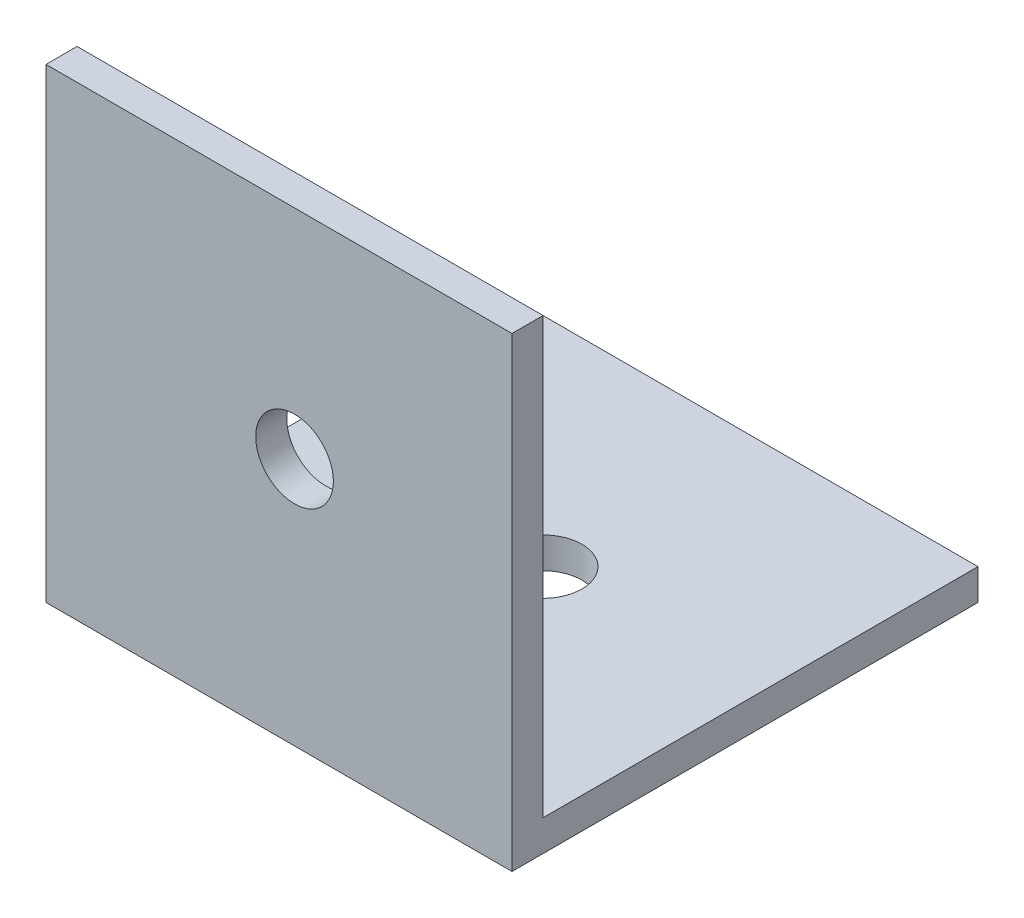
ISO-10303-21;
HEADER;
FILE_DESCRIPTION(('STEP AP214'),'2;1');
FILE_NAME('part.step','',(''),(''),'','','');
FILE_SCHEMA(('AUTOMOTIVE_DESIGN { 1 0 10303 214 1 1 1 1 }'));
ENDSEC;
DATA;
#1=APPLICATION_CONTEXT('core data for automotive mechanical design processes');
#2=APPLICATION_PROTOCOL_DEFINITION('international standard','automotive_design',2000,#1);
#3=PRODUCT_CONTEXT('',#1,'mechanical');
#4=PRODUCT('Part','Part','',(#3));
#5=PRODUCT_RELATED_PRODUCT_CATEGORY('part','',(#4));
#6=PRODUCT_DEFINITION_FORMATION('','',#4);
#7=PRODUCT_DEFINITION_CONTEXT('part definition',#1,'design');
#8=PRODUCT_DEFINITION('design','',#6,#7);
#9=PRODUCT_DEFINITION_SHAPE('','',#8);
#10=(LENGTH_UNIT() NAMED_UNIT(*) SI_UNIT(.MILLI.,.METRE.));
#11=(NAMED_UNIT(*) PLANE_ANGLE_UNIT() SI_UNIT($,.RADIAN.));
#12=(NAMED_UNIT(*) SI_UNIT($,.STERADIAN.) SOLID_ANGLE_UNIT());
#13=UNCERTAINTY_MEASURE_WITH_UNIT(LENGTH_MEASURE(1.E-05),#10,'distance_accuracy_value','');
#14=(GEOMETRIC_REPRESENTATION_CONTEXT(3) GLOBAL_UNCERTAINTY_ASSIGNED_CONTEXT((#13)) GLOBAL_UNIT_ASSIGNED_CONTEXT((#10,
#11,#12)) REPRESENTATION_CONTEXT('',''));
#15=CARTESIAN_POINT('',(0.,0.,0.));
#16=DIRECTION('',(0.,0.,1.));
#17=DIRECTION('',(1.,0.,0.));
#18=AXIS2_PLACEMENT_3D('',#15,#16,#17);
#19=CARTESIAN_POINT('',(0.,0.,1.));
#20=DIRECTION('',(1.,0.,0.));
#21=DIRECTION('',(0.,0.,-1.));
#22=AXIS2_PLACEMENT_3D('',#19,#20,#21);
#23=PLANE('',#22);
#24=DIRECTION('',(0.,-1.,0.));
#25=VECTOR('',#24,1.);
#26=CARTESIAN_POINT('',(0.,0.,0.));
#27=LINE('',#26,#25);
#28=CARTESIAN_POINT('',(0.,15.,0.));
#29=VERTEX_POINT('',#28);
#30=CARTESIAN_POINT('',(0.,1.,0.));
#31=VERTEX_POINT('',#30);
#32=EDGE_CURVE('E108',#29,#31,#27,.T.);
#33=ORIENTED_EDGE('',*,*,#32,.T.);
#34=DIRECTION('',(0.,0.,1.));
#35=VECTOR('',#34,1.);
#36=CARTESIAN_POINT('',(0.,1.,-14.));
#37=LINE('',#36,#35);
#38=CARTESIAN_POINT('',(0.,1.,-14.));
#39=VERTEX_POINT('',#38);
#40=EDGE_CURVE('E72',#39,#31,#37,.T.);
#41=ORIENTED_EDGE('',*,*,#40,.F.);
#42=DIRECTION('',(0.,-1.,0.));
#43=VECTOR('',#42,1.);
#44=CARTESIAN_POINT('',(0.,0.,-14.));
#45=LINE('',#44,#43);
#46=CARTESIAN_POINT('',(0.,0.,-14.));
#47=VERTEX_POINT('',#46);
#48=EDGE_CURVE('E124',#39,#47,#45,.T.);
#49=ORIENTED_EDGE('',*,*,#48,.T.);
#50=DIRECTION('',(0.,0.,-1.));
#51=VECTOR('',#50,1.);
#52=CARTESIAN_POINT('',(0.,0.,1.));
#53=LINE('',#52,#51);
#54=CARTESIAN_POINT('',(0.,0.,1.));
#55=VERTEX_POINT('',#54);
#56=EDGE_CURVE('E42',#55,#47,#53,.T.);
#57=ORIENTED_EDGE('',*,*,#56,.F.);
#58=DIRECTION('',(0.,-1.,0.));
#59=VECTOR('',#58,1.);
#60=CARTESIAN_POINT('',(0.,0.,1.));
#61=LINE('',#60,#59);
#62=CARTESIAN_POINT('',(0.,15.,1.));
#63=VERTEX_POINT('',#62);
#64=EDGE_CURVE('E86',#63,#55,#61,.T.);
#65=ORIENTED_EDGE('',*,*,#64,.F.);
#66=DIRECTION('',(0.,0.,-1.));
#67=VECTOR('',#66,1.);
#68=CARTESIAN_POINT('',(0.,15.,1.));
#69=LINE('',#68,#67);
#70=EDGE_CURVE('E104',#63,#29,#69,.T.);
#71=ORIENTED_EDGE('',*,*,#70,.T.);
#72=EDGE_LOOP('',(#33,#41,#49,#57,#65,#71));
#73=FACE_BOUND('',#72,.T.);
#74=ADVANCED_FACE('F34',(#73),#23,.F.);
#75=CARTESIAN_POINT('',(0.,0.,1.));
#76=DIRECTION('',(0.,1.,0.));
#77=DIRECTION('',(0.,0.,1.));
#78=AXIS2_PLACEMENT_3D('',#75,#76,#77);
#79=PLANE('',#78);
#80=CARTESIAN_POINT('',(8.,0.,-7.));
#81=DIRECTION('',(0.,-1.,0.));
#82=DIRECTION('',(0.,0.,-1.));
#83=AXIS2_PLACEMENT_3D('',#80,#81,#82);
#84=CIRCLE('',#83,1.24999999999999);
#85=CARTESIAN_POINT('',(8.,0.,-8.24999999999999));
#86=VERTEX_POINT('',#85);
#87=EDGE_CURVE('E166',#86,#86,#84,.T.);
#88=ORIENTED_EDGE('',*,*,#87,.F.);
#89=EDGE_LOOP('',(#88));
#90=FACE_BOUND('',#89,.T.);
#91=ORIENTED_EDGE('',*,*,#56,.T.);
#92=DIRECTION('',(1.,0.,0.));
#93=VECTOR('',#92,1.);
#94=CARTESIAN_POINT('',(0.,0.,-14.));
#95=LINE('',#94,#93);
#96=CARTESIAN_POINT('',(15.,0.,-14.));
#97=VERTEX_POINT('',#96);
#98=EDGE_CURVE('E97',#47,#97,#95,.T.);
#99=ORIENTED_EDGE('',*,*,#98,.T.);
#100=DIRECTION('',(0.,0.,-1.));
#101=VECTOR('',#100,1.);
#102=CARTESIAN_POINT('',(15.,0.,1.));
#103=LINE('',#102,#101);
#104=CARTESIAN_POINT('',(15.,0.,1.));
#105=VERTEX_POINT('',#104);
#106=EDGE_CURVE('E93',#105,#97,#103,.T.);
#107=ORIENTED_EDGE('',*,*,#106,.F.);
#108=DIRECTION('',(1.,0.,0.));
#109=VECTOR('',#108,1.);
#110=CARTESIAN_POINT('',(0.,0.,1.));
#111=LINE('',#110,#109);
#112=EDGE_CURVE('E80',#55,#105,#111,.T.);
#113=ORIENTED_EDGE('',*,*,#112,.F.);
#114=EDGE_LOOP('',(#91,#99,#107,#113));
#115=FACE_BOUND('',#114,.T.);
#116=ADVANCED_FACE('F94',(#90,#115),#79,.F.);
#117=CARTESIAN_POINT('',(15.,0.,1.));
#118=DIRECTION('',(-1.,0.,0.));
#119=DIRECTION('',(0.,0.,1.));
#120=AXIS2_PLACEMENT_3D('',#117,#118,#119);
#121=PLANE('',#120);
#122=DIRECTION('',(0.,0.,-1.));
#123=VECTOR('',#122,1.);
#124=CARTESIAN_POINT('',(15.,15.,1.));
#125=LINE('',#124,#123);
#126=CARTESIAN_POINT('',(15.,15.,1.));
#127=VERTEX_POINT('',#126);
#128=CARTESIAN_POINT('',(15.,15.,0.));
#129=VERTEX_POINT('',#128);
#130=EDGE_CURVE('E100',#127,#129,#125,.T.);
#131=ORIENTED_EDGE('',*,*,#130,.F.);
#132=DIRECTION('',(0.,1.,0.));
#133=VECTOR('',#132,1.);
#134=CARTESIAN_POINT('',(15.,0.,1.));
#135=LINE('',#134,#133);
#136=EDGE_CURVE('E84',#105,#127,#135,.T.);
#137=ORIENTED_EDGE('',*,*,#136,.F.);
#138=ORIENTED_EDGE('',*,*,#106,.T.);
#139=DIRECTION('',(0.,1.,0.));
#140=VECTOR('',#139,1.);
#141=CARTESIAN_POINT('',(15.,0.,-14.));
#142=LINE('',#141,#140);
#143=CARTESIAN_POINT('',(15.,1.,-14.));
#144=VERTEX_POINT('',#143);
#145=EDGE_CURVE('E125',#97,#144,#142,.T.);
#146=ORIENTED_EDGE('',*,*,#145,.T.);
#147=DIRECTION('',(0.,0.,1.));
#148=VECTOR('',#147,1.);
#149=CARTESIAN_POINT('',(15.,1.,-14.));
#150=LINE('',#149,#148);
#151=CARTESIAN_POINT('',(15.,1.,0.));
#152=VERTEX_POINT('',#151);
#153=EDGE_CURVE('E137',#144,#152,#150,.T.);
#154=ORIENTED_EDGE('',*,*,#153,.T.);
#155=DIRECTION('',(0.,1.,0.));
#156=VECTOR('',#155,1.);
#157=CARTESIAN_POINT('',(15.,0.,0.));
#158=LINE('',#157,#156);
#159=EDGE_CURVE('E62',#152,#129,#158,.T.);
#160=ORIENTED_EDGE('',*,*,#159,.T.);
#161=EDGE_LOOP('',(#131,#137,#138,#146,#154,#160));
#162=FACE_BOUND('',#161,.T.);
#163=ADVANCED_FACE('F102',(#162),#121,.F.);
#164=CARTESIAN_POINT('',(0.,15.,1.));
#165=DIRECTION('',(0.,-1.,0.));
#166=DIRECTION('',(0.,0.,-1.));
#167=AXIS2_PLACEMENT_3D('',#164,#165,#166);
#168=PLANE('',#167);
#169=DIRECTION('',(-1.,0.,0.));
#170=VECTOR('',#169,1.);
#171=CARTESIAN_POINT('',(0.,15.,0.));
#172=LINE('',#171,#170);
#173=EDGE_CURVE('E112',#129,#29,#172,.T.);
#174=ORIENTED_EDGE('',*,*,#173,.T.);
#175=ORIENTED_EDGE('',*,*,#70,.F.);
#176=DIRECTION('',(-1.,0.,0.));
#177=VECTOR('',#176,1.);
#178=CARTESIAN_POINT('',(0.,15.,1.));
#179=LINE('',#178,#177);
#180=EDGE_CURVE('E50',#127,#63,#179,.T.);
#181=ORIENTED_EDGE('',*,*,#180,.F.);
#182=ORIENTED_EDGE('',*,*,#130,.T.);
#183=EDGE_LOOP('',(#174,#175,#181,#182));
#184=FACE_BOUND('',#183,.T.);
#185=ADVANCED_FACE('F146',(#184),#168,.F.);
#186=CARTESIAN_POINT('',(0.,0.,1.));
#187=DIRECTION('',(0.,0.,-1.));
#188=DIRECTION('',(-1.,0.,0.));
#189=AXIS2_PLACEMENT_3D('',#186,#187,#188);
#190=PLANE('',#189);
#191=CARTESIAN_POINT('',(8.,8.,1.));
#192=DIRECTION('',(0.,0.,1.));
#193=DIRECTION('',(1.,0.,0.));
#194=AXIS2_PLACEMENT_3D('',#191,#192,#193);
#195=CIRCLE('',#194,1.25);
#196=CARTESIAN_POINT('',(9.25,8.,1.));
#197=VERTEX_POINT('',#196);
#198=EDGE_CURVE('E130',#197,#197,#195,.T.);
#199=ORIENTED_EDGE('',*,*,#198,.F.);
#200=EDGE_LOOP('',(#199));
#201=FACE_BOUND('',#200,.T.);
#202=ORIENTED_EDGE('',*,*,#64,.T.);
#203=ORIENTED_EDGE('',*,*,#112,.T.);
#204=ORIENTED_EDGE('',*,*,#136,.T.);
#205=ORIENTED_EDGE('',*,*,#180,.T.);
#206=EDGE_LOOP('',(#202,#203,#204,#205));
#207=FACE_BOUND('',#206,.T.);
#208=ADVANCED_FACE('F82',(#201,#207),#190,.F.);
#209=CARTESIAN_POINT('',(0.,0.,0.));
#210=DIRECTION('',(0.,0.,-1.));
#211=DIRECTION('',(-1.,0.,0.));
#212=AXIS2_PLACEMENT_3D('',#209,#210,#211);
#213=PLANE('',#212);
#214=CARTESIAN_POINT('',(8.,8.,0.));
#215=DIRECTION('',(0.,0.,-1.));
#216=DIRECTION('',(-1.,0.,0.));
#217=AXIS2_PLACEMENT_3D('',#214,#215,#216);
#218=CIRCLE('',#217,1.25);
#219=CARTESIAN_POINT('',(6.75,8.,0.));
#220=VERTEX_POINT('',#219);
#221=EDGE_CURVE('E127',#220,#220,#218,.T.);
#222=ORIENTED_EDGE('',*,*,#221,.F.);
#223=EDGE_LOOP('',(#222));
#224=FACE_BOUND('',#223,.T.);
#225=DIRECTION('',(1.,0.,0.));
#226=VECTOR('',#225,1.);
#227=CARTESIAN_POINT('',(0.,1.,0.));
#228=LINE('',#227,#226);
#229=EDGE_CURVE('E11',#31,#152,#228,.T.);
#230=ORIENTED_EDGE('',*,*,#229,.F.);
#231=ORIENTED_EDGE('',*,*,#32,.F.);
#232=ORIENTED_EDGE('',*,*,#173,.F.);
#233=ORIENTED_EDGE('',*,*,#159,.F.);
#234=EDGE_LOOP('',(#230,#231,#232,#233));
#235=FACE_BOUND('',#234,.T.);
#236=ADVANCED_FACE('F143',(#224,#235),#213,.T.);
#237=CARTESIAN_POINT('',(0.,1.,-14.));
#238=DIRECTION('',(0.,1.,0.));
#239=DIRECTION('',(0.,0.,1.));
#240=AXIS2_PLACEMENT_3D('',#237,#238,#239);
#241=PLANE('',#240);
#242=CARTESIAN_POINT('',(8.,1.,-7.));
#243=DIRECTION('',(0.,1.,0.));
#244=DIRECTION('',(0.,0.,1.));
#245=AXIS2_PLACEMENT_3D('',#242,#243,#244);
#246=CIRCLE('',#245,1.24999999999999);
#247=CARTESIAN_POINT('',(8.,1.,-5.75000000000001));
#248=VERTEX_POINT('',#247);
#249=EDGE_CURVE('E168',#248,#248,#246,.T.);
#250=ORIENTED_EDGE('',*,*,#249,.F.);
#251=EDGE_LOOP('',(#250));
#252=FACE_BOUND('',#251,.T.);
#253=ORIENTED_EDGE('',*,*,#40,.T.);
#254=ORIENTED_EDGE('',*,*,#229,.T.);
#255=ORIENTED_EDGE('',*,*,#153,.F.);
#256=DIRECTION('',(-1.,0.,0.));
#257=VECTOR('',#256,1.);
#258=CARTESIAN_POINT('',(0.,1.,-14.));
#259=LINE('',#258,#257);
#260=EDGE_CURVE('E135',#144,#39,#259,.T.);
#261=ORIENTED_EDGE('',*,*,#260,.T.);
#262=EDGE_LOOP('',(#253,#254,#255,#261));
#263=FACE_BOUND('',#262,.T.);
#264=ADVANCED_FACE('F186',(#252,#263),#241,.T.);
#265=CARTESIAN_POINT('',(0.,0.,-14.));
#266=DIRECTION('',(0.,0.,-1.));
#267=DIRECTION('',(-1.,0.,0.));
#268=AXIS2_PLACEMENT_3D('',#265,#266,#267);
#269=PLANE('',#268);
#270=ORIENTED_EDGE('',*,*,#48,.F.);
#271=ORIENTED_EDGE('',*,*,#260,.F.);
#272=ORIENTED_EDGE('',*,*,#145,.F.);
#273=ORIENTED_EDGE('',*,*,#98,.F.);
#274=EDGE_LOOP('',(#270,#271,#272,#273));
#275=FACE_BOUND('',#274,.T.);
#276=ADVANCED_FACE('F122',(#275),#269,.T.);
#277=CARTESIAN_POINT('',(8.,8.,1.));
#278=DIRECTION('',(0.,0.,1.));
#279=DIRECTION('',(1.,0.,0.));
#280=AXIS2_PLACEMENT_3D('',#277,#278,#279);
#281=CYLINDRICAL_SURFACE('',#280,1.25);
#282=ORIENTED_EDGE('',*,*,#221,.T.);
#283=EDGE_LOOP('',(#282));
#284=FACE_BOUND('',#283,.T.);
#285=ORIENTED_EDGE('',*,*,#198,.T.);
#286=EDGE_LOOP('',(#285));
#287=FACE_BOUND('',#286,.T.);
#288=ADVANCED_FACE('F175',(#284,#287),#281,.F.);
#289=CARTESIAN_POINT('',(8.,0.,-7.));
#290=DIRECTION('',(0.,-1.,0.));
#291=DIRECTION('',(0.,0.,-1.));
#292=AXIS2_PLACEMENT_3D('',#289,#290,#291);
#293=CYLINDRICAL_SURFACE('',#292,1.24999999999999);
#294=ORIENTED_EDGE('',*,*,#249,.T.);
#295=EDGE_LOOP('',(#294));
#296=FACE_BOUND('',#295,.T.);
#297=ORIENTED_EDGE('',*,*,#87,.T.);
#298=EDGE_LOOP('',(#297));
#299=FACE_BOUND('',#298,.T.);
#300=ADVANCED_FACE('F177',(#296,#299),#293,.F.);
#301=CLOSED_SHELL('',(#74,#116,#163,#185,#208,#236,#264,#276,#288,#300));
#302=MANIFOLD_SOLID_BREP('B2',#301);
#303=ADVANCED_BREP_SHAPE_REPRESENTATION('',(#18,#302),#14);
#304=SHAPE_DEFINITION_REPRESENTATION(#9,#303);
ENDSEC;
END-ISO-10303-21;
